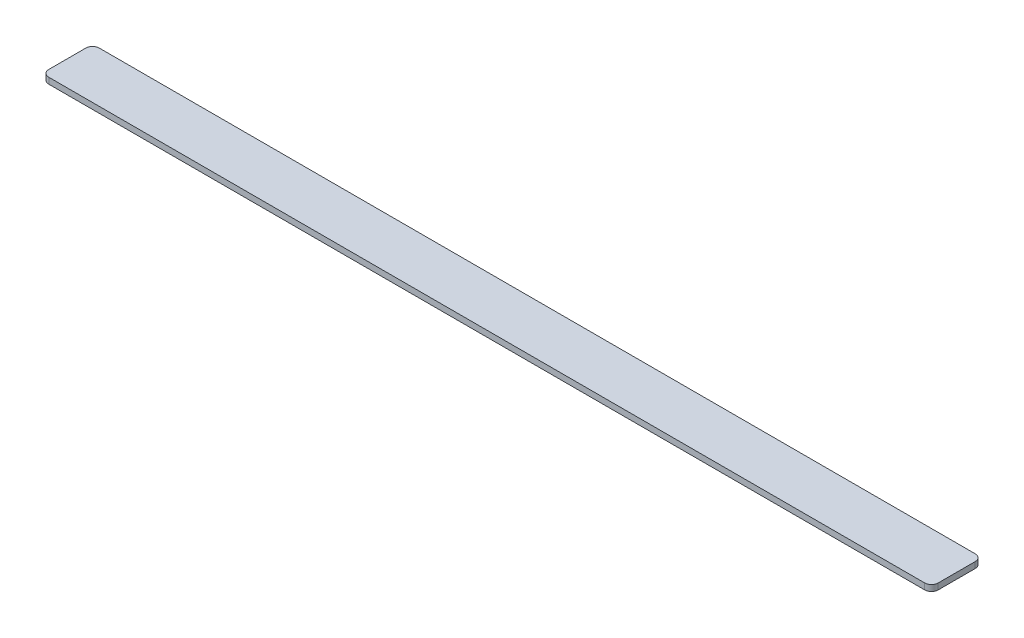
ISO-10303-21;
HEADER;
FILE_DESCRIPTION(('STEP AP214'),'2;1');
FILE_NAME('part.step','',(''),(''),'','','');
FILE_SCHEMA(('AUTOMOTIVE_DESIGN { 1 0 10303 214 1 1 1 1 }'));
ENDSEC;
DATA;
#1=APPLICATION_CONTEXT('core data for automotive mechanical design processes');
#2=APPLICATION_PROTOCOL_DEFINITION('international standard','automotive_design',2000,#1);
#3=PRODUCT_CONTEXT('',#1,'mechanical');
#4=PRODUCT('Part','Part','',(#3));
#5=PRODUCT_RELATED_PRODUCT_CATEGORY('part','',(#4));
#6=PRODUCT_DEFINITION_FORMATION('','',#4);
#7=PRODUCT_DEFINITION_CONTEXT('part definition',#1,'design');
#8=PRODUCT_DEFINITION('design','',#6,#7);
#9=PRODUCT_DEFINITION_SHAPE('','',#8);
#10=(LENGTH_UNIT() NAMED_UNIT(*) SI_UNIT(.MILLI.,.METRE.));
#11=(NAMED_UNIT(*) PLANE_ANGLE_UNIT() SI_UNIT($,.RADIAN.));
#12=(NAMED_UNIT(*) SI_UNIT($,.STERADIAN.) SOLID_ANGLE_UNIT());
#13=UNCERTAINTY_MEASURE_WITH_UNIT(LENGTH_MEASURE(1.E-05),#10,'distance_accuracy_value','');
#14=(GEOMETRIC_REPRESENTATION_CONTEXT(3) GLOBAL_UNCERTAINTY_ASSIGNED_CONTEXT((#13)) GLOBAL_UNIT_ASSIGNED_CONTEXT((#10,
#11,#12)) REPRESENTATION_CONTEXT('',''));
#15=CARTESIAN_POINT('',(0.,0.,0.));
#16=DIRECTION('',(0.,0.,1.));
#17=DIRECTION('',(1.,0.,0.));
#18=AXIS2_PLACEMENT_3D('',#15,#16,#17);
#19=CARTESIAN_POINT('',(167.722922745,-2.286,9.525));
#20=DIRECTION('',(1.,0.,0.));
#21=DIRECTION('',(0.,0.,-1.));
#22=AXIS2_PLACEMENT_3D('',#19,#20,#21);
#23=PLANE('',#22);
#24=DIRECTION('',(0.,0.,-1.));
#25=VECTOR('',#24,1.);
#26=CARTESIAN_POINT('',(167.722922745,0.,9.525));
#27=LINE('',#26,#25);
#28=CARTESIAN_POINT('',(167.722922745,0.,6.985));
#29=VERTEX_POINT('',#28);
#30=CARTESIAN_POINT('',(167.722922745,0.,-6.98499999999999));
#31=VERTEX_POINT('',#30);
#32=EDGE_CURVE('E170',#29,#31,#27,.T.);
#33=ORIENTED_EDGE('',*,*,#32,.F.);
#34=DIRECTION('',(0.,1.,0.));
#35=VECTOR('',#34,1.);
#36=CARTESIAN_POINT('',(167.722922745,-2.286,6.985));
#37=LINE('',#36,#35);
#38=CARTESIAN_POINT('',(167.722922745,-2.286,6.985));
#39=VERTEX_POINT('',#38);
#40=EDGE_CURVE('E150',#29,#39,#37,.F.);
#41=ORIENTED_EDGE('',*,*,#40,.T.);
#42=DIRECTION('',(0.,0.,-1.));
#43=VECTOR('',#42,1.);
#44=CARTESIAN_POINT('',(167.722922745,-2.286,9.525));
#45=LINE('',#44,#43);
#46=CARTESIAN_POINT('',(167.722922745,-2.286,-6.98499999999999));
#47=VERTEX_POINT('',#46);
#48=EDGE_CURVE('E131',#39,#47,#45,.T.);
#49=ORIENTED_EDGE('',*,*,#48,.T.);
#50=DIRECTION('',(0.,1.,0.));
#51=VECTOR('',#50,1.);
#52=CARTESIAN_POINT('',(167.722922745,-2.286,-6.985));
#53=LINE('',#52,#51);
#54=EDGE_CURVE('E147',#47,#31,#53,.T.);
#55=ORIENTED_EDGE('',*,*,#54,.T.);
#56=EDGE_LOOP('',(#33,#41,#49,#55));
#57=FACE_BOUND('',#56,.T.);
#58=ADVANCED_FACE('F45',(#57),#23,.T.);
#59=CARTESIAN_POINT('',(-167.722922745,-2.286,9.525));
#60=DIRECTION('',(0.,0.,1.));
#61=DIRECTION('',(1.,0.,0.));
#62=AXIS2_PLACEMENT_3D('',#59,#60,#61);
#63=PLANE('',#62);
#64=DIRECTION('',(1.,0.,0.));
#65=VECTOR('',#64,1.);
#66=CARTESIAN_POINT('',(-167.722922745,-2.286,9.525));
#67=LINE('',#66,#65);
#68=CARTESIAN_POINT('',(-165.182922745,-2.286,9.525));
#69=VERTEX_POINT('',#68);
#70=CARTESIAN_POINT('',(165.182922745,-2.286,9.525));
#71=VERTEX_POINT('',#70);
#72=EDGE_CURVE('E135',#69,#71,#67,.T.);
#73=ORIENTED_EDGE('',*,*,#72,.T.);
#74=DIRECTION('',(0.,1.,0.));
#75=VECTOR('',#74,1.);
#76=CARTESIAN_POINT('',(165.182922745,-2.286,9.525));
#77=LINE('',#76,#75);
#78=CARTESIAN_POINT('',(165.182922745,0.,9.525));
#79=VERTEX_POINT('',#78);
#80=EDGE_CURVE('E122',#71,#79,#77,.T.);
#81=ORIENTED_EDGE('',*,*,#80,.T.);
#82=DIRECTION('',(1.,0.,0.));
#83=VECTOR('',#82,1.);
#84=CARTESIAN_POINT('',(-167.722922745,0.,9.525));
#85=LINE('',#84,#83);
#86=CARTESIAN_POINT('',(-165.182922745,0.,9.525));
#87=VERTEX_POINT('',#86);
#88=EDGE_CURVE('E114',#87,#79,#85,.T.);
#89=ORIENTED_EDGE('',*,*,#88,.F.);
#90=DIRECTION('',(0.,1.,0.));
#91=VECTOR('',#90,1.);
#92=CARTESIAN_POINT('',(-165.182922745,-2.286,9.525));
#93=LINE('',#92,#91);
#94=EDGE_CURVE('E128',#87,#69,#93,.F.);
#95=ORIENTED_EDGE('',*,*,#94,.T.);
#96=EDGE_LOOP('',(#73,#81,#89,#95));
#97=FACE_BOUND('',#96,.T.);
#98=ADVANCED_FACE('F127',(#97),#63,.T.);
#99=CARTESIAN_POINT('',(-167.722922745,-2.286,9.525));
#100=DIRECTION('',(-1.,0.,0.));
#101=DIRECTION('',(0.,0.,1.));
#102=AXIS2_PLACEMENT_3D('',#99,#100,#101);
#103=PLANE('',#102);
#104=DIRECTION('',(0.,0.,1.));
#105=VECTOR('',#104,1.);
#106=CARTESIAN_POINT('',(-167.722922745,0.,9.525));
#107=LINE('',#106,#105);
#108=CARTESIAN_POINT('',(-167.722922745,0.,-6.98499999999999));
#109=VERTEX_POINT('',#108);
#110=CARTESIAN_POINT('',(-167.722922745,0.,6.985));
#111=VERTEX_POINT('',#110);
#112=EDGE_CURVE('E116',#109,#111,#107,.T.);
#113=ORIENTED_EDGE('',*,*,#112,.F.);
#114=DIRECTION('',(0.,1.,0.));
#115=VECTOR('',#114,1.);
#116=CARTESIAN_POINT('',(-167.722922745,-2.286,-6.985));
#117=LINE('',#116,#115);
#118=CARTESIAN_POINT('',(-167.722922745,-2.286,-6.98499999999999));
#119=VERTEX_POINT('',#118);
#120=EDGE_CURVE('E11',#109,#119,#117,.F.);
#121=ORIENTED_EDGE('',*,*,#120,.T.);
#122=DIRECTION('',(0.,0.,1.));
#123=VECTOR('',#122,1.);
#124=CARTESIAN_POINT('',(-167.722922745,-2.286,9.525));
#125=LINE('',#124,#123);
#126=CARTESIAN_POINT('',(-167.722922745,-2.286,6.985));
#127=VERTEX_POINT('',#126);
#128=EDGE_CURVE('E138',#119,#127,#125,.T.);
#129=ORIENTED_EDGE('',*,*,#128,.T.);
#130=DIRECTION('',(0.,1.,0.));
#131=VECTOR('',#130,1.);
#132=CARTESIAN_POINT('',(-167.722922745,-2.286,6.985));
#133=LINE('',#132,#131);
#134=EDGE_CURVE('E53',#127,#111,#133,.T.);
#135=ORIENTED_EDGE('',*,*,#134,.T.);
#136=EDGE_LOOP('',(#113,#121,#129,#135));
#137=FACE_BOUND('',#136,.T.);
#138=ADVANCED_FACE('F163',(#137),#103,.T.);
#139=CARTESIAN_POINT('',(-167.722922745,-2.286,-9.525));
#140=DIRECTION('',(0.,0.,-1.));
#141=DIRECTION('',(-1.,0.,0.));
#142=AXIS2_PLACEMENT_3D('',#139,#140,#141);
#143=PLANE('',#142);
#144=DIRECTION('',(-1.,0.,0.));
#145=VECTOR('',#144,1.);
#146=CARTESIAN_POINT('',(-167.722922745,0.,-9.525));
#147=LINE('',#146,#145);
#148=CARTESIAN_POINT('',(165.182922745,0.,-9.525));
#149=VERTEX_POINT('',#148);
#150=CARTESIAN_POINT('',(-165.182922745,0.,-9.525));
#151=VERTEX_POINT('',#150);
#152=EDGE_CURVE('E173',#149,#151,#147,.T.);
#153=ORIENTED_EDGE('',*,*,#152,.F.);
#154=DIRECTION('',(0.,1.,0.));
#155=VECTOR('',#154,1.);
#156=CARTESIAN_POINT('',(165.182922745,-2.286,-9.525));
#157=LINE('',#156,#155);
#158=CARTESIAN_POINT('',(165.182922745,-2.286,-9.525));
#159=VERTEX_POINT('',#158);
#160=EDGE_CURVE('E67',#149,#159,#157,.F.);
#161=ORIENTED_EDGE('',*,*,#160,.T.);
#162=DIRECTION('',(-1.,0.,0.));
#163=VECTOR('',#162,1.);
#164=CARTESIAN_POINT('',(-167.722922745,-2.286,-9.525));
#165=LINE('',#164,#163);
#166=CARTESIAN_POINT('',(-165.182922745,-2.286,-9.525));
#167=VERTEX_POINT('',#166);
#168=EDGE_CURVE('E165',#159,#167,#165,.T.);
#169=ORIENTED_EDGE('',*,*,#168,.T.);
#170=DIRECTION('',(0.,1.,0.));
#171=VECTOR('',#170,1.);
#172=CARTESIAN_POINT('',(-165.182922745,-2.286,-9.525));
#173=LINE('',#172,#171);
#174=EDGE_CURVE('E158',#167,#151,#173,.T.);
#175=ORIENTED_EDGE('',*,*,#174,.T.);
#176=EDGE_LOOP('',(#153,#161,#169,#175));
#177=FACE_BOUND('',#176,.T.);
#178=ADVANCED_FACE('F175',(#177),#143,.T.);
#179=CARTESIAN_POINT('',(0.,-2.286,0.));
#180=DIRECTION('',(0.,-1.,0.));
#181=DIRECTION('',(0.,0.,-1.));
#182=AXIS2_PLACEMENT_3D('',#179,#180,#181);
#183=PLANE('',#182);
#184=ORIENTED_EDGE('',*,*,#48,.F.);
#185=CARTESIAN_POINT('',(165.182922745,-2.286,6.985));
#186=DIRECTION('',(0.,-1.,0.));
#187=DIRECTION('',(0.,0.,-1.));
#188=AXIS2_PLACEMENT_3D('',#185,#186,#187);
#189=CIRCLE('',#188,2.54);
#190=EDGE_CURVE('E156',#39,#71,#189,.T.);
#191=ORIENTED_EDGE('',*,*,#190,.T.);
#192=ORIENTED_EDGE('',*,*,#72,.F.);
#193=CARTESIAN_POINT('',(-165.182922745,-2.286,6.985));
#194=DIRECTION('',(0.,-1.,0.));
#195=DIRECTION('',(0.,0.,-1.));
#196=AXIS2_PLACEMENT_3D('',#193,#194,#195);
#197=CIRCLE('',#196,2.54);
#198=EDGE_CURVE('E134',#69,#127,#197,.T.);
#199=ORIENTED_EDGE('',*,*,#198,.T.);
#200=ORIENTED_EDGE('',*,*,#128,.F.);
#201=CARTESIAN_POINT('',(-165.182922745,-2.286,-6.985));
#202=DIRECTION('',(0.,-1.,0.));
#203=DIRECTION('',(0.,0.,-1.));
#204=AXIS2_PLACEMENT_3D('',#201,#202,#203);
#205=CIRCLE('',#204,2.54);
#206=EDGE_CURVE('E60',#119,#167,#205,.T.);
#207=ORIENTED_EDGE('',*,*,#206,.T.);
#208=ORIENTED_EDGE('',*,*,#168,.F.);
#209=CARTESIAN_POINT('',(165.182922745,-2.286,-6.985));
#210=DIRECTION('',(0.,-1.,0.));
#211=DIRECTION('',(0.,0.,-1.));
#212=AXIS2_PLACEMENT_3D('',#209,#210,#211);
#213=CIRCLE('',#212,2.54);
#214=EDGE_CURVE('E154',#159,#47,#213,.T.);
#215=ORIENTED_EDGE('',*,*,#214,.T.);
#216=EDGE_LOOP('',(#184,#191,#192,#199,#200,#207,#208,#215));
#217=FACE_BOUND('',#216,.T.);
#218=ADVANCED_FACE('F183',(#217),#183,.T.);
#219=CARTESIAN_POINT('',(0.,0.,0.));
#220=DIRECTION('',(0.,-1.,0.));
#221=DIRECTION('',(0.,0.,-1.));
#222=AXIS2_PLACEMENT_3D('',#219,#220,#221);
#223=PLANE('',#222);
#224=ORIENTED_EDGE('',*,*,#88,.T.);
#225=CARTESIAN_POINT('',(165.182922745,0.,6.985));
#226=DIRECTION('',(0.,-1.,0.));
#227=DIRECTION('',(0.,0.,-1.));
#228=AXIS2_PLACEMENT_3D('',#225,#226,#227);
#229=CIRCLE('',#228,2.54);
#230=EDGE_CURVE('E145',#79,#29,#229,.F.);
#231=ORIENTED_EDGE('',*,*,#230,.T.);
#232=ORIENTED_EDGE('',*,*,#32,.T.);
#233=CARTESIAN_POINT('',(165.182922745,0.,-6.985));
#234=DIRECTION('',(0.,-1.,0.));
#235=DIRECTION('',(0.,0.,-1.));
#236=AXIS2_PLACEMENT_3D('',#233,#234,#235);
#237=CIRCLE('',#236,2.54);
#238=EDGE_CURVE('E143',#31,#149,#237,.F.);
#239=ORIENTED_EDGE('',*,*,#238,.T.);
#240=ORIENTED_EDGE('',*,*,#152,.T.);
#241=CARTESIAN_POINT('',(-165.182922745,0.,-6.985));
#242=DIRECTION('',(0.,-1.,0.));
#243=DIRECTION('',(0.,0.,-1.));
#244=AXIS2_PLACEMENT_3D('',#241,#242,#243);
#245=CIRCLE('',#244,2.54);
#246=EDGE_CURVE('E121',#151,#109,#245,.F.);
#247=ORIENTED_EDGE('',*,*,#246,.T.);
#248=ORIENTED_EDGE('',*,*,#112,.T.);
#249=CARTESIAN_POINT('',(-165.182922745,0.,6.985));
#250=DIRECTION('',(0.,-1.,0.));
#251=DIRECTION('',(0.,0.,-1.));
#252=AXIS2_PLACEMENT_3D('',#249,#250,#251);
#253=CIRCLE('',#252,2.54);
#254=EDGE_CURVE('E111',#111,#87,#253,.F.);
#255=ORIENTED_EDGE('',*,*,#254,.T.);
#256=EDGE_LOOP('',(#224,#231,#232,#239,#240,#247,#248,#255));
#257=FACE_BOUND('',#256,.T.);
#258=ADVANCED_FACE('F113',(#257),#223,.F.);
#259=CARTESIAN_POINT('',(165.182922745,-2.286,6.985));
#260=DIRECTION('',(0.,1.,0.));
#261=DIRECTION('',(0.,0.,1.));
#262=AXIS2_PLACEMENT_3D('',#259,#260,#261);
#263=CYLINDRICAL_SURFACE('',#262,2.54);
#264=ORIENTED_EDGE('',*,*,#190,.F.);
#265=ORIENTED_EDGE('',*,*,#40,.F.);
#266=ORIENTED_EDGE('',*,*,#230,.F.);
#267=ORIENTED_EDGE('',*,*,#80,.F.);
#268=EDGE_LOOP('',(#264,#265,#266,#267));
#269=FACE_BOUND('',#268,.T.);
#270=ADVANCED_FACE('F189',(#269),#263,.T.);
#271=CARTESIAN_POINT('',(165.182922745,-2.286,-6.985));
#272=DIRECTION('',(0.,1.,0.));
#273=DIRECTION('',(0.,0.,1.));
#274=AXIS2_PLACEMENT_3D('',#271,#272,#273);
#275=CYLINDRICAL_SURFACE('',#274,2.54);
#276=ORIENTED_EDGE('',*,*,#214,.F.);
#277=ORIENTED_EDGE('',*,*,#160,.F.);
#278=ORIENTED_EDGE('',*,*,#238,.F.);
#279=ORIENTED_EDGE('',*,*,#54,.F.);
#280=EDGE_LOOP('',(#276,#277,#278,#279));
#281=FACE_BOUND('',#280,.T.);
#282=ADVANCED_FACE('F179',(#281),#275,.T.);
#283=CARTESIAN_POINT('',(-165.182922745,-2.286,-6.985));
#284=DIRECTION('',(0.,1.,0.));
#285=DIRECTION('',(0.,0.,1.));
#286=AXIS2_PLACEMENT_3D('',#283,#284,#285);
#287=CYLINDRICAL_SURFACE('',#286,2.54);
#288=ORIENTED_EDGE('',*,*,#206,.F.);
#289=ORIENTED_EDGE('',*,*,#120,.F.);
#290=ORIENTED_EDGE('',*,*,#246,.F.);
#291=ORIENTED_EDGE('',*,*,#174,.F.);
#292=EDGE_LOOP('',(#288,#289,#290,#291));
#293=FACE_BOUND('',#292,.T.);
#294=ADVANCED_FACE('F196',(#293),#287,.T.);
#295=CARTESIAN_POINT('',(-165.182922745,-2.286,6.985));
#296=DIRECTION('',(0.,1.,0.));
#297=DIRECTION('',(0.,0.,1.));
#298=AXIS2_PLACEMENT_3D('',#295,#296,#297);
#299=CYLINDRICAL_SURFACE('',#298,2.54);
#300=ORIENTED_EDGE('',*,*,#198,.F.);
#301=ORIENTED_EDGE('',*,*,#94,.F.);
#302=ORIENTED_EDGE('',*,*,#254,.F.);
#303=ORIENTED_EDGE('',*,*,#134,.F.);
#304=EDGE_LOOP('',(#300,#301,#302,#303));
#305=FACE_BOUND('',#304,.T.);
#306=ADVANCED_FACE('F47',(#305),#299,.T.);
#307=CLOSED_SHELL('',(#58,#98,#138,#178,#218,#258,#270,#282,#294,#306));
#308=MANIFOLD_SOLID_BREP('B2',#307);
#309=ADVANCED_BREP_SHAPE_REPRESENTATION('',(#18,#308),#14);
#310=SHAPE_DEFINITION_REPRESENTATION(#9,#309);
ENDSEC;
END-ISO-10303-21;
